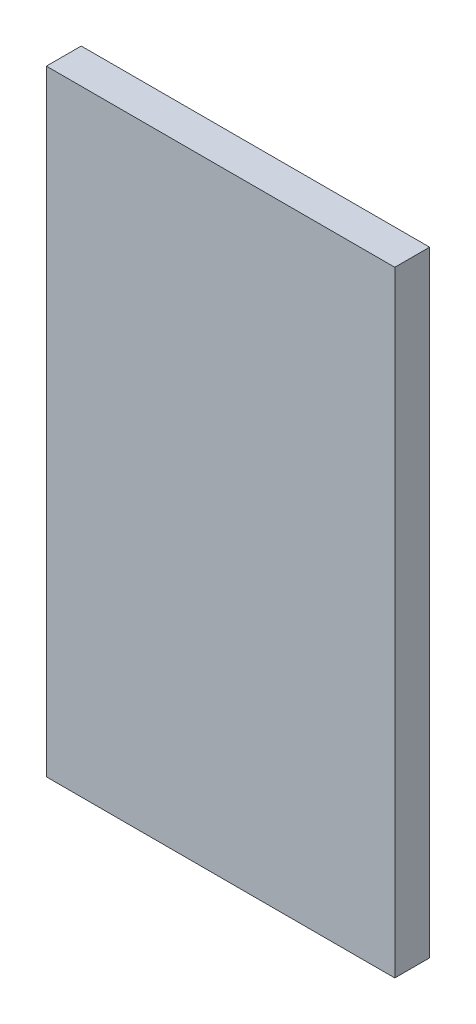
ISO-10303-21;
HEADER;
FILE_DESCRIPTION(('STEP AP214'),'2;1');
FILE_NAME('part.step','',(''),(''),'','','');
FILE_SCHEMA(('AUTOMOTIVE_DESIGN { 1 0 10303 214 1 1 1 1 }'));
ENDSEC;
DATA;
#1=APPLICATION_CONTEXT('core data for automotive mechanical design processes');
#2=APPLICATION_PROTOCOL_DEFINITION('international standard','automotive_design',2000,#1);
#3=PRODUCT_CONTEXT('',#1,'mechanical');
#4=PRODUCT('Part','Part','',(#3));
#5=PRODUCT_RELATED_PRODUCT_CATEGORY('part','',(#4));
#6=PRODUCT_DEFINITION_FORMATION('','',#4);
#7=PRODUCT_DEFINITION_CONTEXT('part definition',#1,'design');
#8=PRODUCT_DEFINITION('design','',#6,#7);
#9=PRODUCT_DEFINITION_SHAPE('','',#8);
#10=(LENGTH_UNIT() NAMED_UNIT(*) SI_UNIT(.MILLI.,.METRE.));
#11=(NAMED_UNIT(*) PLANE_ANGLE_UNIT() SI_UNIT($,.RADIAN.));
#12=(NAMED_UNIT(*) SI_UNIT($,.STERADIAN.) SOLID_ANGLE_UNIT());
#13=UNCERTAINTY_MEASURE_WITH_UNIT(LENGTH_MEASURE(1.E-05),#10,'distance_accuracy_value','');
#14=(GEOMETRIC_REPRESENTATION_CONTEXT(3) GLOBAL_UNCERTAINTY_ASSIGNED_CONTEXT((#13)) GLOBAL_UNIT_ASSIGNED_CONTEXT((#10,
#11,#12)) REPRESENTATION_CONTEXT('',''));
#15=CARTESIAN_POINT('',(0.,0.,0.));
#16=DIRECTION('',(0.,0.,1.));
#17=DIRECTION('',(1.,0.,0.));
#18=AXIS2_PLACEMENT_3D('',#15,#16,#17);
#19=CARTESIAN_POINT('',(150.,-265.,30.));
#20=DIRECTION('',(-1.,0.,0.));
#21=DIRECTION('',(0.,0.,1.));
#22=AXIS2_PLACEMENT_3D('',#19,#20,#21);
#23=PLANE('',#22);
#24=DIRECTION('',(0.,1.,0.));
#25=VECTOR('',#24,1.);
#26=CARTESIAN_POINT('',(150.,-265.,0.));
#27=LINE('',#26,#25);
#28=CARTESIAN_POINT('',(150.,-265.,0.));
#29=VERTEX_POINT('',#28);
#30=CARTESIAN_POINT('',(150.,265.,0.));
#31=VERTEX_POINT('',#30);
#32=EDGE_CURVE('E100',#29,#31,#27,.T.);
#33=ORIENTED_EDGE('',*,*,#32,.T.);
#34=DIRECTION('',(0.,0.,-1.));
#35=VECTOR('',#34,1.);
#36=CARTESIAN_POINT('',(150.,265.,30.));
#37=LINE('',#36,#35);
#38=CARTESIAN_POINT('',(150.,265.,30.));
#39=VERTEX_POINT('',#38);
#40=EDGE_CURVE('E11',#39,#31,#37,.T.);
#41=ORIENTED_EDGE('',*,*,#40,.F.);
#42=DIRECTION('',(0.,1.,0.));
#43=VECTOR('',#42,1.);
#44=CARTESIAN_POINT('',(150.,-265.,30.));
#45=LINE('',#44,#43);
#46=CARTESIAN_POINT('',(150.,-265.,30.));
#47=VERTEX_POINT('',#46);
#48=EDGE_CURVE('E88',#47,#39,#45,.T.);
#49=ORIENTED_EDGE('',*,*,#48,.F.);
#50=DIRECTION('',(0.,0.,-1.));
#51=VECTOR('',#50,1.);
#52=CARTESIAN_POINT('',(150.,-265.,30.));
#53=LINE('',#52,#51);
#54=EDGE_CURVE('E96',#47,#29,#53,.T.);
#55=ORIENTED_EDGE('',*,*,#54,.T.);
#56=EDGE_LOOP('',(#33,#41,#49,#55));
#57=FACE_BOUND('',#56,.T.);
#58=ADVANCED_FACE('F37',(#57),#23,.F.);
#59=CARTESIAN_POINT('',(-150.,265.,30.));
#60=DIRECTION('',(0.,-1.,0.));
#61=DIRECTION('',(0.,0.,-1.));
#62=AXIS2_PLACEMENT_3D('',#59,#60,#61);
#63=PLANE('',#62);
#64=DIRECTION('',(-1.,0.,0.));
#65=VECTOR('',#64,1.);
#66=CARTESIAN_POINT('',(-150.,265.,0.));
#67=LINE('',#66,#65);
#68=CARTESIAN_POINT('',(-150.,265.,0.));
#69=VERTEX_POINT('',#68);
#70=EDGE_CURVE('E92',#31,#69,#67,.T.);
#71=ORIENTED_EDGE('',*,*,#70,.T.);
#72=DIRECTION('',(0.,0.,-1.));
#73=VECTOR('',#72,1.);
#74=CARTESIAN_POINT('',(-150.,265.,30.));
#75=LINE('',#74,#73);
#76=CARTESIAN_POINT('',(-150.,265.,30.));
#77=VERTEX_POINT('',#76);
#78=EDGE_CURVE('E45',#77,#69,#75,.T.);
#79=ORIENTED_EDGE('',*,*,#78,.F.);
#80=DIRECTION('',(-1.,0.,0.));
#81=VECTOR('',#80,1.);
#82=CARTESIAN_POINT('',(-150.,265.,30.));
#83=LINE('',#82,#81);
#84=EDGE_CURVE('E83',#39,#77,#83,.T.);
#85=ORIENTED_EDGE('',*,*,#84,.F.);
#86=ORIENTED_EDGE('',*,*,#40,.T.);
#87=EDGE_LOOP('',(#71,#79,#85,#86));
#88=FACE_BOUND('',#87,.T.);
#89=ADVANCED_FACE('F91',(#88),#63,.F.);
#90=CARTESIAN_POINT('',(-150.,-265.,30.));
#91=DIRECTION('',(1.,0.,0.));
#92=DIRECTION('',(0.,0.,-1.));
#93=AXIS2_PLACEMENT_3D('',#90,#91,#92);
#94=PLANE('',#93);
#95=DIRECTION('',(0.,-1.,0.));
#96=VECTOR('',#95,1.);
#97=CARTESIAN_POINT('',(-150.,-265.,0.));
#98=LINE('',#97,#96);
#99=CARTESIAN_POINT('',(-150.,-265.,0.));
#100=VERTEX_POINT('',#99);
#101=EDGE_CURVE('E70',#69,#100,#98,.T.);
#102=ORIENTED_EDGE('',*,*,#101,.T.);
#103=DIRECTION('',(0.,0.,-1.));
#104=VECTOR('',#103,1.);
#105=CARTESIAN_POINT('',(-150.,-265.,30.));
#106=LINE('',#105,#104);
#107=CARTESIAN_POINT('',(-150.,-265.,30.));
#108=VERTEX_POINT('',#107);
#109=EDGE_CURVE('E93',#108,#100,#106,.T.);
#110=ORIENTED_EDGE('',*,*,#109,.F.);
#111=DIRECTION('',(0.,-1.,0.));
#112=VECTOR('',#111,1.);
#113=CARTESIAN_POINT('',(-150.,-265.,30.));
#114=LINE('',#113,#112);
#115=EDGE_CURVE('E86',#77,#108,#114,.T.);
#116=ORIENTED_EDGE('',*,*,#115,.F.);
#117=ORIENTED_EDGE('',*,*,#78,.T.);
#118=EDGE_LOOP('',(#102,#110,#116,#117));
#119=FACE_BOUND('',#118,.T.);
#120=ADVANCED_FACE('F94',(#119),#94,.F.);
#121=CARTESIAN_POINT('',(-150.,-265.,30.));
#122=DIRECTION('',(0.,1.,0.));
#123=DIRECTION('',(0.,0.,1.));
#124=AXIS2_PLACEMENT_3D('',#121,#122,#123);
#125=PLANE('',#124);
#126=DIRECTION('',(1.,0.,0.));
#127=VECTOR('',#126,1.);
#128=CARTESIAN_POINT('',(-150.,-265.,0.));
#129=LINE('',#128,#127);
#130=EDGE_CURVE('E76',#100,#29,#129,.T.);
#131=ORIENTED_EDGE('',*,*,#130,.T.);
#132=ORIENTED_EDGE('',*,*,#54,.F.);
#133=DIRECTION('',(1.,0.,0.));
#134=VECTOR('',#133,1.);
#135=CARTESIAN_POINT('',(-150.,-265.,30.));
#136=LINE('',#135,#134);
#137=EDGE_CURVE('E53',#108,#47,#136,.T.);
#138=ORIENTED_EDGE('',*,*,#137,.F.);
#139=ORIENTED_EDGE('',*,*,#109,.T.);
#140=EDGE_LOOP('',(#131,#132,#138,#139));
#141=FACE_BOUND('',#140,.T.);
#142=ADVANCED_FACE('F107',(#141),#125,.F.);
#143=CARTESIAN_POINT('',(0.,0.,30.));
#144=DIRECTION('',(0.,0.,-1.));
#145=DIRECTION('',(-1.,0.,0.));
#146=AXIS2_PLACEMENT_3D('',#143,#144,#145);
#147=PLANE('',#146);
#148=ORIENTED_EDGE('',*,*,#48,.T.);
#149=ORIENTED_EDGE('',*,*,#84,.T.);
#150=ORIENTED_EDGE('',*,*,#115,.T.);
#151=ORIENTED_EDGE('',*,*,#137,.T.);
#152=EDGE_LOOP('',(#148,#149,#150,#151));
#153=FACE_BOUND('',#152,.T.);
#154=ADVANCED_FACE('F84',(#153),#147,.F.);
#155=CARTESIAN_POINT('',(0.,0.,0.));
#156=DIRECTION('',(0.,0.,-1.));
#157=DIRECTION('',(-1.,0.,0.));
#158=AXIS2_PLACEMENT_3D('',#155,#156,#157);
#159=PLANE('',#158);
#160=ORIENTED_EDGE('',*,*,#32,.F.);
#161=ORIENTED_EDGE('',*,*,#130,.F.);
#162=ORIENTED_EDGE('',*,*,#101,.F.);
#163=ORIENTED_EDGE('',*,*,#70,.F.);
#164=EDGE_LOOP('',(#160,#161,#162,#163));
#165=FACE_BOUND('',#164,.T.);
#166=ADVANCED_FACE('F110',(#165),#159,.T.);
#167=CLOSED_SHELL('',(#58,#89,#120,#142,#154,#166));
#168=MANIFOLD_SOLID_BREP('B2',#167);
#169=ADVANCED_BREP_SHAPE_REPRESENTATION('',(#18,#168),#14);
#170=SHAPE_DEFINITION_REPRESENTATION(#9,#169);
ENDSEC;
END-ISO-10303-21;
